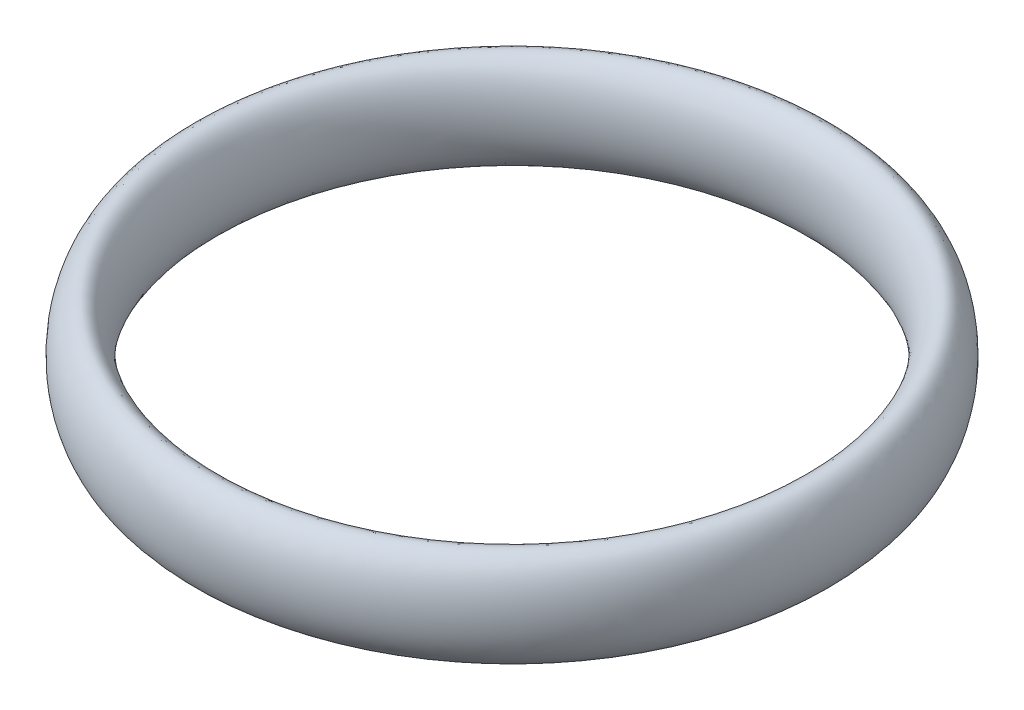
ISO-10303-21;
HEADER;
FILE_DESCRIPTION(('STEP AP214'),'2;1');
FILE_NAME('part.step','',(''),(''),'','','');
FILE_SCHEMA(('AUTOMOTIVE_DESIGN { 1 0 10303 214 1 1 1 1 }'));
ENDSEC;
DATA;
#1=APPLICATION_CONTEXT('core data for automotive mechanical design processes');
#2=APPLICATION_PROTOCOL_DEFINITION('international standard','automotive_design',2000,#1);
#3=PRODUCT_CONTEXT('',#1,'mechanical');
#4=PRODUCT('Part','Part','',(#3));
#5=PRODUCT_RELATED_PRODUCT_CATEGORY('part','',(#4));
#6=PRODUCT_DEFINITION_FORMATION('','',#4);
#7=PRODUCT_DEFINITION_CONTEXT('part definition',#1,'design');
#8=PRODUCT_DEFINITION('design','',#6,#7);
#9=PRODUCT_DEFINITION_SHAPE('','',#8);
#10=(LENGTH_UNIT() NAMED_UNIT(*) SI_UNIT(.MILLI.,.METRE.));
#11=(NAMED_UNIT(*) PLANE_ANGLE_UNIT() SI_UNIT($,.RADIAN.));
#12=(NAMED_UNIT(*) SI_UNIT($,.STERADIAN.) SOLID_ANGLE_UNIT());
#13=UNCERTAINTY_MEASURE_WITH_UNIT(LENGTH_MEASURE(1.E-05),#10,'distance_accuracy_value','');
#14=(GEOMETRIC_REPRESENTATION_CONTEXT(3) GLOBAL_UNCERTAINTY_ASSIGNED_CONTEXT((#13)) GLOBAL_UNIT_ASSIGNED_CONTEXT((#10,
#11,#12)) REPRESENTATION_CONTEXT('',''));
#15=CARTESIAN_POINT('',(0.,0.,0.));
#16=DIRECTION('',(0.,0.,1.));
#17=DIRECTION('',(1.,0.,0.));
#18=AXIS2_PLACEMENT_3D('',#15,#16,#17);
#19=CARTESIAN_POINT('',(6.35,1.01599999999999,0.));
#20=DIRECTION('',(0.,0.,1.));
#21=DIRECTION('',(0.,1.,0.));
#22=AXIS2_PLACEMENT_3D('',#19,#20,#21);
#23=ELLIPSE('',#22,1.016,0.508);
#24=CARTESIAN_POINT('',(0.,0.,0.));
#25=DIRECTION('',(0.,-1.,0.));
#26=AXIS1_PLACEMENT('',#24,#25);
#27=SURFACE_OF_REVOLUTION('',#23,#26);
#28=ADVANCED_FACE('F29',(),#27,.F.);
#29=CLOSED_SHELL('',(#28));
#30=MANIFOLD_SOLID_BREP('B2',#29);
#31=ADVANCED_BREP_SHAPE_REPRESENTATION('',(#18,#30),#14);
#32=SHAPE_DEFINITION_REPRESENTATION(#9,#31);
ENDSEC;
END-ISO-10303-21;
